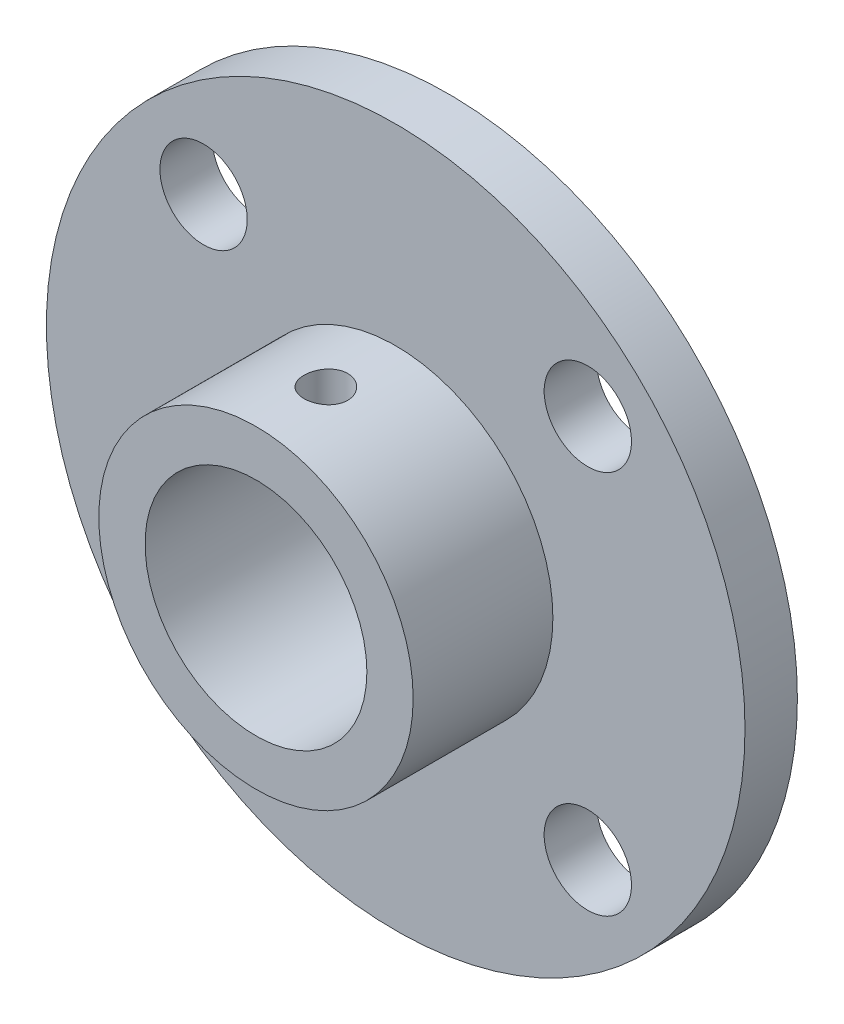
ISO-10303-21;
HEADER;
FILE_DESCRIPTION(('STEP AP214'),'2;1');
FILE_NAME('part.step','',(''),(''),'','','');
FILE_SCHEMA(('AUTOMOTIVE_DESIGN { 1 0 10303 214 1 1 1 1 }'));
ENDSEC;
DATA;
#1=APPLICATION_CONTEXT('core data for automotive mechanical design processes');
#2=APPLICATION_PROTOCOL_DEFINITION('international standard','automotive_design',2000,#1);
#3=PRODUCT_CONTEXT('',#1,'mechanical');
#4=PRODUCT('Part','Part','',(#3));
#5=PRODUCT_RELATED_PRODUCT_CATEGORY('part','',(#4));
#6=PRODUCT_DEFINITION_FORMATION('','',#4);
#7=PRODUCT_DEFINITION_CONTEXT('part definition',#1,'design');
#8=PRODUCT_DEFINITION('design','',#6,#7);
#9=PRODUCT_DEFINITION_SHAPE('','',#8);
#10=(LENGTH_UNIT() NAMED_UNIT(*) SI_UNIT(.MILLI.,.METRE.));
#11=(NAMED_UNIT(*) PLANE_ANGLE_UNIT() SI_UNIT($,.RADIAN.));
#12=(NAMED_UNIT(*) SI_UNIT($,.STERADIAN.) SOLID_ANGLE_UNIT());
#13=UNCERTAINTY_MEASURE_WITH_UNIT(LENGTH_MEASURE(1.E-05),#10,'distance_accuracy_value','');
#14=(GEOMETRIC_REPRESENTATION_CONTEXT(3) GLOBAL_UNCERTAINTY_ASSIGNED_CONTEXT((#13)) GLOBAL_UNIT_ASSIGNED_CONTEXT((#10,
#11,#12)) REPRESENTATION_CONTEXT('',''));
#15=CARTESIAN_POINT('',(0.,0.,0.));
#16=DIRECTION('',(0.,0.,1.));
#17=DIRECTION('',(1.,0.,0.));
#18=AXIS2_PLACEMENT_3D('',#15,#16,#17);
#19=CARTESIAN_POINT('',(0.,0.,3.));
#20=DIRECTION('',(0.,0.,-1.));
#21=DIRECTION('',(-1.,0.,0.));
#22=AXIS2_PLACEMENT_3D('',#19,#20,#21);
#23=CYLINDRICAL_SURFACE('',#22,20.);
#24=CARTESIAN_POINT('',(0.,0.,3.));
#25=DIRECTION('',(0.,0.,1.));
#26=DIRECTION('',(1.,0.,0.));
#27=AXIS2_PLACEMENT_3D('',#24,#25,#26);
#28=CIRCLE('',#27,20.);
#29=CARTESIAN_POINT('',(20.,0.,3.));
#30=VERTEX_POINT('',#29);
#31=EDGE_CURVE('E10',#30,#30,#28,.T.);
#32=ORIENTED_EDGE('',*,*,#31,.F.);
#33=EDGE_LOOP('',(#32));
#34=FACE_BOUND('',#33,.T.);
#35=CARTESIAN_POINT('',(0.,0.,0.));
#36=DIRECTION('',(0.,0.,1.));
#37=DIRECTION('',(1.,0.,0.));
#38=AXIS2_PLACEMENT_3D('',#35,#36,#37);
#39=CIRCLE('',#38,20.);
#40=CARTESIAN_POINT('',(20.,0.,0.));
#41=VERTEX_POINT('',#40);
#42=EDGE_CURVE('E35',#41,#41,#39,.T.);
#43=ORIENTED_EDGE('',*,*,#42,.T.);
#44=EDGE_LOOP('',(#43));
#45=FACE_BOUND('',#44,.T.);
#46=ADVANCED_FACE('F32',(#34,#45),#23,.T.);
#47=CARTESIAN_POINT('',(0.,0.,3.));
#48=DIRECTION('',(0.,0.,1.));
#49=DIRECTION('',(1.,0.,0.));
#50=AXIS2_PLACEMENT_3D('',#47,#48,#49);
#51=PLANE('',#50);
#52=CARTESIAN_POINT('',(-10.9999999999999,11.0000000000001,3.));
#53=DIRECTION('',(0.,0.,1.));
#54=DIRECTION('',(1.,0.,0.));
#55=AXIS2_PLACEMENT_3D('',#52,#53,#54);
#56=CIRCLE('',#55,2.5);
#57=CARTESIAN_POINT('',(-8.49999999999989,11.0000000000001,3.));
#58=VERTEX_POINT('',#57);
#59=EDGE_CURVE('E142',#58,#58,#56,.T.);
#60=ORIENTED_EDGE('',*,*,#59,.F.);
#61=EDGE_LOOP('',(#60));
#62=FACE_BOUND('',#61,.T.);
#63=CARTESIAN_POINT('',(-11.,-11.,3.));
#64=DIRECTION('',(0.,0.,1.));
#65=DIRECTION('',(1.,0.,0.));
#66=AXIS2_PLACEMENT_3D('',#63,#64,#65);
#67=CIRCLE('',#66,2.5);
#68=CARTESIAN_POINT('',(-8.49999999999996,-11.,3.));
#69=VERTEX_POINT('',#68);
#70=EDGE_CURVE('E138',#69,#69,#67,.T.);
#71=ORIENTED_EDGE('',*,*,#70,.F.);
#72=EDGE_LOOP('',(#71));
#73=FACE_BOUND('',#72,.T.);
#74=CARTESIAN_POINT('',(11.,-11.,3.));
#75=DIRECTION('',(0.,0.,1.));
#76=DIRECTION('',(1.,0.,0.));
#77=AXIS2_PLACEMENT_3D('',#74,#75,#76);
#78=CIRCLE('',#77,2.5);
#79=CARTESIAN_POINT('',(13.5,-11.,3.));
#80=VERTEX_POINT('',#79);
#81=EDGE_CURVE('E134',#80,#80,#78,.T.);
#82=ORIENTED_EDGE('',*,*,#81,.F.);
#83=EDGE_LOOP('',(#82));
#84=FACE_BOUND('',#83,.T.);
#85=CARTESIAN_POINT('',(11.,11.,3.));
#86=DIRECTION('',(0.,0.,1.));
#87=DIRECTION('',(1.,0.,0.));
#88=AXIS2_PLACEMENT_3D('',#85,#86,#87);
#89=CIRCLE('',#88,2.5);
#90=CARTESIAN_POINT('',(13.5,11.,3.));
#91=VERTEX_POINT('',#90);
#92=EDGE_CURVE('E128',#91,#91,#89,.T.);
#93=ORIENTED_EDGE('',*,*,#92,.F.);
#94=EDGE_LOOP('',(#93));
#95=FACE_BOUND('',#94,.T.);
#96=CARTESIAN_POINT('',(0.,0.,3.));
#97=DIRECTION('',(0.,0.,1.));
#98=DIRECTION('',(1.,0.,0.));
#99=AXIS2_PLACEMENT_3D('',#96,#97,#98);
#100=CIRCLE('',#99,9.);
#101=CARTESIAN_POINT('',(9.,0.,3.));
#102=VERTEX_POINT('',#101);
#103=EDGE_CURVE('E44',#102,#102,#100,.T.);
#104=ORIENTED_EDGE('',*,*,#103,.F.);
#105=EDGE_LOOP('',(#104));
#106=FACE_BOUND('',#105,.T.);
#107=ORIENTED_EDGE('',*,*,#31,.T.);
#108=EDGE_LOOP('',(#107));
#109=FACE_BOUND('',#108,.T.);
#110=ADVANCED_FACE('F95',(#62,#73,#84,#95,#106,#109),#51,.T.);
#111=CARTESIAN_POINT('',(0.,0.,0.));
#112=DIRECTION('',(0.,0.,1.));
#113=DIRECTION('',(1.,0.,0.));
#114=AXIS2_PLACEMENT_3D('',#111,#112,#113);
#115=PLANE('',#114);
#116=CARTESIAN_POINT('',(-10.9999999999999,11.0000000000001,0.));
#117=DIRECTION('',(0.,0.,1.));
#118=DIRECTION('',(1.,0.,0.));
#119=AXIS2_PLACEMENT_3D('',#116,#117,#118);
#120=CIRCLE('',#119,2.5);
#121=CARTESIAN_POINT('',(-8.49999999999989,11.0000000000001,0.));
#122=VERTEX_POINT('',#121);
#123=EDGE_CURVE('E111',#122,#122,#120,.T.);
#124=ORIENTED_EDGE('',*,*,#123,.T.);
#125=EDGE_LOOP('',(#124));
#126=FACE_BOUND('',#125,.T.);
#127=CARTESIAN_POINT('',(-11.,-11.,0.));
#128=DIRECTION('',(0.,0.,1.));
#129=DIRECTION('',(1.,0.,0.));
#130=AXIS2_PLACEMENT_3D('',#127,#128,#129);
#131=CIRCLE('',#130,2.5);
#132=CARTESIAN_POINT('',(-8.49999999999996,-11.,0.));
#133=VERTEX_POINT('',#132);
#134=EDGE_CURVE('E115',#133,#133,#131,.T.);
#135=ORIENTED_EDGE('',*,*,#134,.T.);
#136=EDGE_LOOP('',(#135));
#137=FACE_BOUND('',#136,.T.);
#138=CARTESIAN_POINT('',(11.,-11.,0.));
#139=DIRECTION('',(0.,0.,1.));
#140=DIRECTION('',(1.,0.,0.));
#141=AXIS2_PLACEMENT_3D('',#138,#139,#140);
#142=CIRCLE('',#141,2.5);
#143=CARTESIAN_POINT('',(13.5,-11.,0.));
#144=VERTEX_POINT('',#143);
#145=EDGE_CURVE('E119',#144,#144,#142,.T.);
#146=ORIENTED_EDGE('',*,*,#145,.T.);
#147=EDGE_LOOP('',(#146));
#148=FACE_BOUND('',#147,.T.);
#149=CARTESIAN_POINT('',(11.,11.,0.));
#150=DIRECTION('',(0.,0.,1.));
#151=DIRECTION('',(1.,0.,0.));
#152=AXIS2_PLACEMENT_3D('',#149,#150,#151);
#153=CIRCLE('',#152,2.5);
#154=CARTESIAN_POINT('',(13.5,11.,0.));
#155=VERTEX_POINT('',#154);
#156=EDGE_CURVE('E123',#155,#155,#153,.T.);
#157=ORIENTED_EDGE('',*,*,#156,.T.);
#158=EDGE_LOOP('',(#157));
#159=FACE_BOUND('',#158,.T.);
#160=CARTESIAN_POINT('',(0.,0.,0.));
#161=DIRECTION('',(0.,0.,1.));
#162=DIRECTION('',(1.,0.,0.));
#163=AXIS2_PLACEMENT_3D('',#160,#161,#162);
#164=CIRCLE('',#163,6.35);
#165=CARTESIAN_POINT('',(6.35,0.,0.));
#166=VERTEX_POINT('',#165);
#167=EDGE_CURVE('E47',#166,#166,#164,.T.);
#168=ORIENTED_EDGE('',*,*,#167,.T.);
#169=EDGE_LOOP('',(#168));
#170=FACE_BOUND('',#169,.T.);
#171=ORIENTED_EDGE('',*,*,#42,.F.);
#172=EDGE_LOOP('',(#171));
#173=FACE_BOUND('',#172,.T.);
#174=ADVANCED_FACE('F90',(#126,#137,#148,#159,#170,#173),#115,.F.);
#175=CARTESIAN_POINT('',(0.,0.,11.));
#176=DIRECTION('',(0.,0.,-1.));
#177=DIRECTION('',(-1.,0.,0.));
#178=AXIS2_PLACEMENT_3D('',#175,#176,#177);
#179=CYLINDRICAL_SURFACE('',#178,9.);
#180=CARTESIAN_POINT('',(0.,9.,8.25));
#181=CARTESIAN_POINT('',(-0.0698524432674792,8.99999894112753,8.24999707641344));
#182=CARTESIAN_POINT('',(-0.139746876410525,8.99917821909749,8.24412500721024));
#183=CARTESIAN_POINT('',(-0.277586159937056,8.99598316286198,8.22079550905035));
#184=CARTESIAN_POINT('',(-0.345528975998051,8.99360726484072,8.20332641839353));
#185=CARTESIAN_POINT('',(-0.477449936054394,8.98756916249447,8.15733148038858));
#186=CARTESIAN_POINT('',(-0.541430886330462,8.98390788118544,8.12881356553055));
#187=CARTESIAN_POINT('',(-0.663688186066638,8.97570481006727,8.06154896636124));
#188=CARTESIAN_POINT('',(-0.721965412327889,8.97116315591379,8.0228038576146));
#189=CARTESIAN_POINT('',(-0.831564576835309,8.96167110812553,7.93590611207195));
#190=CARTESIAN_POINT('',(-0.882842518790516,8.95671841784774,7.88769823037006));
#191=CARTESIAN_POINT('',(-0.976608234008467,8.94698072235377,7.78336218085061));
#192=CARTESIAN_POINT('',(-1.01909552946635,8.94219572626412,7.72723358279095));
#193=CARTESIAN_POINT('',(-1.09424186139764,8.93331280195876,7.60835810446568));
#194=CARTESIAN_POINT('',(-1.12685893577153,8.92921783911826,7.5455844573968));
#195=CARTESIAN_POINT('',(-1.18107087638653,8.9222095544648,7.41538379504843));
#196=CARTESIAN_POINT('',(-1.20266625739018,8.91929617746777,7.34795699725896));
#197=CARTESIAN_POINT('',(-1.23408646989725,8.91500325152303,7.21082413412879));
#198=CARTESIAN_POINT('',(-1.24398617833559,8.91361394942638,7.14113553555096));
#199=CARTESIAN_POINT('',(-1.25196586814038,8.91249677033615,7.00107340136254));
#200=CARTESIAN_POINT('',(-1.25004643292129,8.91276881133565,6.93069989973122));
#201=CARTESIAN_POINT('',(-1.23450363802969,8.91493465758728,6.79179120897347));
#202=CARTESIAN_POINT('',(-1.22096324330855,8.91681696642587,6.72324653180948));
#203=CARTESIAN_POINT('',(-1.18269256535991,8.92197331658115,6.58941166568421));
#204=CARTESIAN_POINT('',(-1.15796200719353,8.92524739209301,6.52412155673045));
#205=CARTESIAN_POINT('',(-1.09792538280573,8.93283122971518,6.39839427134722));
#206=CARTESIAN_POINT('',(-1.06258375105995,8.93714446505612,6.33797429604758));
#207=CARTESIAN_POINT('',(-0.982353578958052,8.94631804418278,6.22389103836506));
#208=CARTESIAN_POINT('',(-0.937464500359812,8.95117841880646,6.17022813718728));
#209=CARTESIAN_POINT('',(-0.838956215124468,8.96094958209835,6.07070114459299));
#210=CARTESIAN_POINT('',(-0.78526559218933,8.96586044627415,6.02490771633149));
#211=CARTESIAN_POINT('',(-0.670922859167276,8.97514050674014,5.94297142256395));
#212=CARTESIAN_POINT('',(-0.610270725934996,8.97950970122931,5.90682858914517));
#213=CARTESIAN_POINT('',(-0.483668566732571,8.98721779212188,5.84521749124961));
#214=CARTESIAN_POINT('',(-0.417716089958331,8.99055620841331,5.81975419907646));
#215=CARTESIAN_POINT('',(-0.282414617975587,8.99582244302653,5.78028392791702));
#216=CARTESIAN_POINT('',(-0.213065819610991,8.99775034299601,5.76627628581537));
#217=CARTESIAN_POINT('',(-0.0735506507379415,8.99996760516492,5.75020779285971));
#218=CARTESIAN_POINT('',(-0.00339568328222967,9.00027030327137,5.74804970487464));
#219=CARTESIAN_POINT('',(0.136275022553969,8.99923922007978,5.75548417654772));
#220=CARTESIAN_POINT('',(0.205790777778712,8.99790548202965,5.76507642566666));
#221=CARTESIAN_POINT('',(0.34191877930876,8.99375965195284,5.79565845560324));
#222=CARTESIAN_POINT('',(0.408541763946676,8.99095364519698,5.81660133297071));
#223=CARTESIAN_POINT('',(0.537330456139088,8.98417711217329,5.86924099234226));
#224=CARTESIAN_POINT('',(0.599495980656537,8.98020653811879,5.90093821564694));
#225=CARTESIAN_POINT('',(0.718035810499776,8.97150954082181,5.97441824451338));
#226=CARTESIAN_POINT('',(0.774371184438057,8.96677851553782,6.016263300766));
#227=CARTESIAN_POINT('',(0.879254172768981,8.95710284930006,6.10876385195142));
#228=CARTESIAN_POINT('',(0.927801401893308,8.95215819779385,6.1594197824873));
#229=CARTESIAN_POINT('',(1.01607974304115,8.94257081023239,6.26853494672837));
#230=CARTESIAN_POINT('',(1.05574600476847,8.93793045954482,6.32704688764327));
#231=CARTESIAN_POINT('',(1.12468695508689,8.92951793446703,6.44996001851086));
#232=CARTESIAN_POINT('',(1.15396189183904,8.92574573934466,6.51436106777625));
#233=CARTESIAN_POINT('',(1.20118657145913,8.91951345452543,6.64702354578474));
#234=CARTESIAN_POINT('',(1.21917157417326,8.91704928346968,6.71527222279974));
#235=CARTESIAN_POINT('',(1.24341873550689,8.91370081228886,6.85385776577743));
#236=CARTESIAN_POINT('',(1.24968157911894,8.91281641984846,6.92419450947847));
#237=CARTESIAN_POINT('',(1.25029208082018,8.91273074448822,7.06431381146004));
#238=CARTESIAN_POINT('',(1.24474165841307,8.91351506465158,7.13409593850588));
#239=CARTESIAN_POINT('',(1.22210038835406,8.91664731052215,7.27172460841475));
#240=CARTESIAN_POINT('',(1.20500954927505,8.91899523506783,7.3395711527156));
#241=CARTESIAN_POINT('',(1.1598067233738,8.92498537468198,7.47138137218678));
#242=CARTESIAN_POINT('',(1.13170083734509,8.92862687318732,7.5353471741365));
#243=CARTESIAN_POINT('',(1.06527577701553,8.93679486162302,7.6576715834595));
#244=CARTESIAN_POINT('',(1.02695635742405,8.94132137280736,7.71603005612003));
#245=CARTESIAN_POINT('',(0.940817900572817,8.95079601194598,7.82600262825919));
#246=CARTESIAN_POINT('',(0.892923123926585,8.9557473092005,7.87755713579389));
#247=CARTESIAN_POINT('',(0.789153098909224,8.9654864535163,7.97193457291452));
#248=CARTESIAN_POINT('',(0.73327598706804,8.97027426208699,8.01475545796018));
#249=CARTESIAN_POINT('',(0.614821941865001,8.97917230387635,8.09062624054552));
#250=CARTESIAN_POINT('',(0.552214803422001,8.98327925254998,8.12362935049968));
#251=CARTESIAN_POINT('',(0.422321399113687,8.99032025416553,8.17860417514526));
#252=CARTESIAN_POINT('',(0.355040177626121,8.99325554918744,8.20058757828223));
#253=CARTESIAN_POINT('',(0.239529012760907,8.99693485713489,8.22778270119299));
#254=CARTESIAN_POINT('',(0.192019668179785,8.99807852526027,8.23610181399691));
#255=CARTESIAN_POINT('',(0.0963468711203362,8.9996114581541,8.24721144433625));
#256=CARTESIAN_POINT('',(0.0481834251286111,9.00000073039825,8.25000201665693));
#257=CARTESIAN_POINT('',(0.,9.,8.25));
#258=B_SPLINE_CURVE_WITH_KNOTS('',3,(#180,#181,#182,#183,#184,#185,#186,#187,#188,#189,#190,
#191,#192,#193,#194,#195,#196,#197,#198,#199,#200,#201,#202,#203,#204,#205,#206,#207,#208,#209,
#210,#211,#212,#213,#214,#215,#216,#217,#218,#219,#220,#221,#222,#223,#224,#225,#226,#227,#228,
#229,#230,#231,#232,#233,#234,#235,#236,#237,#238,#239,#240,#241,#242,#243,#244,#245,#246,#247,
#248,#249,#250,#251,#252,#253,#254,#255,#256,#257),.UNSPECIFIED.,.T.,.F.,(4,2,2,2,2,2,2,2,2,2,2,
2,2,2,2,2,2,2,2,2,2,2,2,2,2,2,2,2,2,2,2,2,2,2,2,2,2,2,4),(0.,0.209381295059175,
0.418973458745447,0.628415424004145,0.837825142200538,1.0484958752077,1.25917805595891,
1.47074373528117,1.68229953263234,1.89249345858176,2.10267700905926,2.31137237127791,
2.52007286135607,2.72948082119297,2.93890058963983,3.15011234914944,3.36132481090823,
3.57263550251898,3.78393396145113,3.99349589004416,4.20305228043053,4.4117492645698,
4.62045481354833,4.83047455215844,5.04050467694123,5.2520217860405,5.46353384344124,
5.67438199262966,5.88521782037458,6.09424202940505,6.30326608316046,6.512174530099,
6.72108799468395,6.93172442182196,7.14241010247461,7.3540843082496,7.56553351660859,
7.7099637964639,7.8543926450753),.UNSPECIFIED.);
#259=CARTESIAN_POINT('',(0.,9.,8.25));
#260=VERTEX_POINT('',#259);
#261=EDGE_CURVE('E53',#260,#260,#258,.T.);
#262=ORIENTED_EDGE('',*,*,#261,.T.);
#263=EDGE_LOOP('',(#262));
#264=FACE_BOUND('',#263,.T.);
#265=CARTESIAN_POINT('',(0.,0.,11.));
#266=DIRECTION('',(0.,0.,1.));
#267=DIRECTION('',(1.,0.,0.));
#268=AXIS2_PLACEMENT_3D('',#265,#266,#267);
#269=CIRCLE('',#268,9.);
#270=CARTESIAN_POINT('',(9.,0.,11.));
#271=VERTEX_POINT('',#270);
#272=EDGE_CURVE('E42',#271,#271,#269,.T.);
#273=ORIENTED_EDGE('',*,*,#272,.F.);
#274=EDGE_LOOP('',(#273));
#275=FACE_BOUND('',#274,.T.);
#276=ORIENTED_EDGE('',*,*,#103,.T.);
#277=EDGE_LOOP('',(#276));
#278=FACE_BOUND('',#277,.T.);
#279=ADVANCED_FACE('F67',(#264,#275,#278),#179,.T.);
#280=CARTESIAN_POINT('',(0.,0.,11.));
#281=DIRECTION('',(0.,0.,1.));
#282=DIRECTION('',(1.,0.,0.));
#283=AXIS2_PLACEMENT_3D('',#280,#281,#282);
#284=PLANE('',#283);
#285=CARTESIAN_POINT('',(0.,0.,11.));
#286=DIRECTION('',(0.,0.,1.));
#287=DIRECTION('',(1.,0.,0.));
#288=AXIS2_PLACEMENT_3D('',#285,#286,#287);
#289=CIRCLE('',#288,6.35);
#290=CARTESIAN_POINT('',(6.35,0.,11.));
#291=VERTEX_POINT('',#290);
#292=EDGE_CURVE('E50',#291,#291,#289,.T.);
#293=ORIENTED_EDGE('',*,*,#292,.F.);
#294=EDGE_LOOP('',(#293));
#295=FACE_BOUND('',#294,.T.);
#296=ORIENTED_EDGE('',*,*,#272,.T.);
#297=EDGE_LOOP('',(#296));
#298=FACE_BOUND('',#297,.T.);
#299=ADVANCED_FACE('F83',(#295,#298),#284,.T.);
#300=CARTESIAN_POINT('',(0.,0.,0.));
#301=DIRECTION('',(0.,0.,1.));
#302=DIRECTION('',(1.,0.,0.));
#303=AXIS2_PLACEMENT_3D('',#300,#301,#302);
#304=CYLINDRICAL_SURFACE('',#303,6.35);
#305=CARTESIAN_POINT('',(0.,6.35,8.25));
#306=CARTESIAN_POINT('',(0.0694939804326166,6.34999872344055,8.24999741697149));
#307=CARTESIAN_POINT('',(0.139020856807098,6.34884746695947,8.24418512233233));
#308=CARTESIAN_POINT('',(0.276110920333323,6.34436590183971,8.22110707488043));
#309=CARTESIAN_POINT('',(0.343672476376257,6.34103383426819,8.20383207667014));
#310=CARTESIAN_POINT('',(0.474829848521738,6.33256289060586,8.1583817049578));
#311=CARTESIAN_POINT('',(0.538429341852969,6.32742572017194,8.13021661907805));
#312=CARTESIAN_POINT('',(0.65999535360919,6.31590367713382,8.06381579844673));
#313=CARTESIAN_POINT('',(0.717962238037102,6.30951888568045,8.02558071863606));
#314=CARTESIAN_POINT('',(0.827384016512086,6.29611102614492,7.93959245680302));
#315=CARTESIAN_POINT('',(0.878754225040864,6.28908132948856,7.89173253360937));
#316=CARTESIAN_POINT('',(0.972791329937009,6.2752244237706,7.78808265203321));
#317=CARTESIAN_POINT('',(1.01545756098707,6.26839723022205,7.7322920879986));
#318=CARTESIAN_POINT('',(1.09123391279335,6.25565368156531,7.6137582073905));
#319=CARTESIAN_POINT('',(1.12425674252627,6.24974585984846,7.55095808890527));
#320=CARTESIAN_POINT('',(1.17924978458522,6.23960391049848,7.42056529207539));
#321=CARTESIAN_POINT('',(1.2012210527667,6.23536962298579,7.35297307226771));
#322=CARTESIAN_POINT('',(1.23321317099972,6.22912114018685,7.21582462774841));
#323=CARTESIAN_POINT('',(1.24338237441818,6.22707940916393,7.14630428882713));
#324=CARTESIAN_POINT('',(1.25194241392171,6.22536429547634,7.00651652417689));
#325=CARTESIAN_POINT('',(1.25033441599247,6.22569067835976,6.93624917309264));
#326=CARTESIAN_POINT('',(1.23550573337242,6.22864988383405,6.79804466350049));
#327=CARTESIAN_POINT('',(1.22245476039046,6.23124899784788,6.73008846659444));
#328=CARTESIAN_POINT('',(1.18537832222863,6.23840776786276,6.59734938288738));
#329=CARTESIAN_POINT('',(1.16135234775691,6.24296751484584,6.53256664350426));
#330=CARTESIAN_POINT('',(1.10284485747248,6.25356844492134,6.40752240468414));
#331=CARTESIAN_POINT('',(1.06829575022772,6.25961915520019,6.34729337201777));
#332=CARTESIAN_POINT('',(0.989770436249238,6.27251408593659,6.23342386111392));
#333=CARTESIAN_POINT('',(0.945793178637777,6.27935839481092,6.17978411837919));
#334=CARTESIAN_POINT('',(0.848749620379541,6.29321559250291,6.0796362168699));
#335=CARTESIAN_POINT('',(0.795538391483493,6.30022934156696,6.03326849889531));
#336=CARTESIAN_POINT('',(0.682019835627284,6.31352591556468,5.95009527076996));
#337=CARTESIAN_POINT('',(0.621712423039482,6.31980873167657,5.91328987602224));
#338=CARTESIAN_POINT('',(0.495559855492552,6.33095024356266,5.85026145162072));
#339=CARTESIAN_POINT('',(0.429706667639596,6.33580682618573,5.82405410291238));
#340=CARTESIAN_POINT('',(0.294415437445406,6.34353255640573,5.78311343800312));
#341=CARTESIAN_POINT('',(0.224977816567587,6.3464019370917,5.76837877608714));
#342=CARTESIAN_POINT('',(0.0856960204581704,6.34979761511535,5.75099971472866));
#343=CARTESIAN_POINT('',(0.0158767138616835,6.35036116751766,5.74816306115028));
#344=CARTESIAN_POINT('',(-0.123238319169051,6.34918502460119,5.75414330556373));
#345=CARTESIAN_POINT('',(-0.19253407386959,6.34744545453345,5.7629595698332));
#346=CARTESIAN_POINT('',(-0.328017411524044,6.34188181040703,5.79183563304381));
#347=CARTESIAN_POINT('',(-0.394226758532903,6.3380759676032,5.81179713777489));
#348=CARTESIAN_POINT('',(-0.522358707908789,6.32880490671267,5.86228990537444));
#349=CARTESIAN_POINT('',(-0.584280996267094,6.32333956723251,5.89282194150836));
#350=CARTESIAN_POINT('',(-0.702894389008582,6.31126292459246,5.9640074630924));
#351=CARTESIAN_POINT('',(-0.759514422690816,6.30463875071603,6.00477714131565));
#352=CARTESIAN_POINT('',(-0.865178401164781,6.29101022941264,6.09512464324686));
#353=CARTESIAN_POINT('',(-0.914221559867101,6.2840058426409,6.14470337973566));
#354=CARTESIAN_POINT('',(-1.00407868802173,6.27028126377194,6.2521356229158));
#355=CARTESIAN_POINT('',(-1.04476087118854,6.26356677403919,6.31010020991976));
#356=CARTESIAN_POINT('',(-1.11581163487924,6.25130144140895,6.43215321541632));
#357=CARTESIAN_POINT('',(-1.14618062108291,6.24575055274337,6.49624139290435));
#358=CARTESIAN_POINT('',(-1.19556121034271,6.23648663322854,6.62840420204532));
#359=CARTESIAN_POINT('',(-1.21463070325767,6.23276425161642,6.6964565174941));
#360=CARTESIAN_POINT('',(-1.24104736373123,6.22755858712954,6.83488024343693));
#361=CARTESIAN_POINT('',(-1.24839600622804,6.2260750225259,6.90525136099793));
#362=CARTESIAN_POINT('',(-1.25110911670658,6.22553026233713,7.04499277196996));
#363=CARTESIAN_POINT('',(-1.24668173183846,6.22642699327119,7.11435894429892));
#364=CARTESIAN_POINT('',(-1.22642690288144,6.23044796366243,7.25133721493432));
#365=CARTESIAN_POINT('',(-1.21059954408838,6.23357218645326,7.31894932636092));
#366=CARTESIAN_POINT('',(-1.16808561930223,6.24167758718142,7.45037304713031));
#367=CARTESIAN_POINT('',(-1.14142381041251,6.24665452942732,7.51419294325068));
#368=CARTESIAN_POINT('',(-1.07802140699671,6.25790715548942,7.63648638961607));
#369=CARTESIAN_POINT('',(-1.04128000120944,6.26418294383389,7.6949595090179));
#370=CARTESIAN_POINT('',(-0.958047153780955,6.27745535581054,7.80593762567599));
#371=CARTESIAN_POINT('',(-0.911405090098395,6.28446214955247,7.8583284614444));
#372=CARTESIAN_POINT('',(-0.810006714298532,6.29833330286004,7.95460876853267));
#373=CARTESIAN_POINT('',(-0.755248540568528,6.30519762933471,7.99849628408175));
#374=CARTESIAN_POINT('',(-0.638509398203908,6.31809192156363,8.07694085549248));
#375=CARTESIAN_POINT('',(-0.576461177409875,6.32411277788587,8.11139938409306));
#376=CARTESIAN_POINT('',(-0.447354677582577,6.33455228311075,8.16934635102892));
#377=CARTESIAN_POINT('',(-0.380301028513241,6.33897239107068,8.19284478497479));
#378=CARTESIAN_POINT('',(-0.260903753738919,6.3448426925249,8.22359658768645));
#379=CARTESIAN_POINT('',(-0.209244697378744,6.34676546742744,8.23348040451041));
#380=CARTESIAN_POINT('',(-0.10506334458243,6.34934458466464,8.24668298824628));
#381=CARTESIAN_POINT('',(-0.0525410741960243,6.35000096514553,8.25000195290429));
#382=CARTESIAN_POINT('',(0.,6.35,8.25));
#383=B_SPLINE_CURVE_WITH_KNOTS('',3,(#305,#306,#307,#308,#309,#310,#311,#312,#313,#314,#315,
#316,#317,#318,#319,#320,#321,#322,#323,#324,#325,#326,#327,#328,#329,#330,#331,#332,#333,#334,
#335,#336,#337,#338,#339,#340,#341,#342,#343,#344,#345,#346,#347,#348,#349,#350,#351,#352,#353,
#354,#355,#356,#357,#358,#359,#360,#361,#362,#363,#364,#365,#366,#367,#368,#369,#370,#371,#372,
#373,#374,#375,#376,#377,#378,#379,#380,#381,#382),.UNSPECIFIED.,.T.,.F.,(4,2,2,2,2,2,2,2,2,2,2,
2,2,2,2,2,2,2,2,2,2,2,2,2,2,2,2,2,2,2,2,2,2,2,2,2,2,2,4),(0.,0.208289747189659,
0.416747697814534,0.625009202121002,0.833257164680658,1.04395644558372,1.25467182595345,
1.46723931776153,1.67978649721884,1.88963196168972,2.09945665097821,2.3062210720878,
2.51299508901675,2.7211262980827,2.92928071788109,3.14105959839086,3.35284103463857,
3.56493468769528,3.77700345899183,3.98563198908575,4.19424917376995,4.40105490064573,
4.60787575916645,4.81715935266284,5.02646464445815,5.23885147330543,5.45122994673927,
5.66251073275074,5.87376492933511,6.08131002421398,6.28885356623401,6.49592550697448,
6.70301411889161,6.91351361259454,7.12406146403358,7.33673198768615,7.54920817465149,
7.70669083222362,7.86416874604055),.UNSPECIFIED.);
#384=CARTESIAN_POINT('',(0.,6.35,8.25));
#385=VERTEX_POINT('',#384);
#386=EDGE_CURVE('E62',#385,#385,#383,.T.);
#387=ORIENTED_EDGE('',*,*,#386,.T.);
#388=EDGE_LOOP('',(#387));
#389=FACE_BOUND('',#388,.T.);
#390=ORIENTED_EDGE('',*,*,#167,.F.);
#391=EDGE_LOOP('',(#390));
#392=FACE_BOUND('',#391,.T.);
#393=ORIENTED_EDGE('',*,*,#292,.T.);
#394=EDGE_LOOP('',(#393));
#395=FACE_BOUND('',#394,.T.);
#396=ADVANCED_FACE('F76',(#389,#392,#395),#304,.F.);
#397=CARTESIAN_POINT('',(0.,9.,7.));
#398=DIRECTION('',(0.,1.,0.));
#399=DIRECTION('',(0.,0.,1.));
#400=AXIS2_PLACEMENT_3D('',#397,#398,#399);
#401=CYLINDRICAL_SURFACE('',#400,1.25);
#402=ORIENTED_EDGE('',*,*,#386,.F.);
#403=EDGE_LOOP('',(#402));
#404=FACE_BOUND('',#403,.T.);
#405=ORIENTED_EDGE('',*,*,#261,.F.);
#406=EDGE_LOOP('',(#405));
#407=FACE_BOUND('',#406,.T.);
#408=ADVANCED_FACE('F71',(#404,#407),#401,.F.);
#409=CARTESIAN_POINT('',(11.,11.,3.));
#410=DIRECTION('',(0.,0.,1.));
#411=DIRECTION('',(1.,0.,0.));
#412=AXIS2_PLACEMENT_3D('',#409,#410,#411);
#413=CYLINDRICAL_SURFACE('',#412,2.5);
#414=ORIENTED_EDGE('',*,*,#156,.F.);
#415=EDGE_LOOP('',(#414));
#416=FACE_BOUND('',#415,.T.);
#417=ORIENTED_EDGE('',*,*,#92,.T.);
#418=EDGE_LOOP('',(#417));
#419=FACE_BOUND('',#418,.T.);
#420=ADVANCED_FACE('F75',(#416,#419),#413,.F.);
#421=CARTESIAN_POINT('',(11.,-11.,3.));
#422=DIRECTION('',(0.,0.,1.));
#423=DIRECTION('',(1.,0.,0.));
#424=AXIS2_PLACEMENT_3D('',#421,#422,#423);
#425=CYLINDRICAL_SURFACE('',#424,2.5);
#426=ORIENTED_EDGE('',*,*,#145,.F.);
#427=EDGE_LOOP('',(#426));
#428=FACE_BOUND('',#427,.T.);
#429=ORIENTED_EDGE('',*,*,#81,.T.);
#430=EDGE_LOOP('',(#429));
#431=FACE_BOUND('',#430,.T.);
#432=ADVANCED_FACE('F158',(#428,#431),#425,.F.);
#433=CARTESIAN_POINT('',(-11.,-11.,3.));
#434=DIRECTION('',(0.,0.,1.));
#435=DIRECTION('',(1.,0.,0.));
#436=AXIS2_PLACEMENT_3D('',#433,#434,#435);
#437=CYLINDRICAL_SURFACE('',#436,2.5);
#438=ORIENTED_EDGE('',*,*,#134,.F.);
#439=EDGE_LOOP('',(#438));
#440=FACE_BOUND('',#439,.T.);
#441=ORIENTED_EDGE('',*,*,#70,.T.);
#442=EDGE_LOOP('',(#441));
#443=FACE_BOUND('',#442,.T.);
#444=ADVANCED_FACE('F162',(#440,#443),#437,.F.);
#445=CARTESIAN_POINT('',(-10.9999999999999,11.0000000000001,3.));
#446=DIRECTION('',(0.,0.,1.));
#447=DIRECTION('',(1.,0.,0.));
#448=AXIS2_PLACEMENT_3D('',#445,#446,#447);
#449=CYLINDRICAL_SURFACE('',#448,2.5);
#450=ORIENTED_EDGE('',*,*,#123,.F.);
#451=EDGE_LOOP('',(#450));
#452=FACE_BOUND('',#451,.T.);
#453=ORIENTED_EDGE('',*,*,#59,.T.);
#454=EDGE_LOOP('',(#453));
#455=FACE_BOUND('',#454,.T.);
#456=ADVANCED_FACE('F146',(#452,#455),#449,.F.);
#457=CLOSED_SHELL('',(#46,#110,#174,#279,#299,#396,#408,#420,#432,#444,#456));
#458=MANIFOLD_SOLID_BREP('B2',#457);
#459=ADVANCED_BREP_SHAPE_REPRESENTATION('',(#18,#458),#14);
#460=SHAPE_DEFINITION_REPRESENTATION(#9,#459);
ENDSEC;
END-ISO-10303-21;
